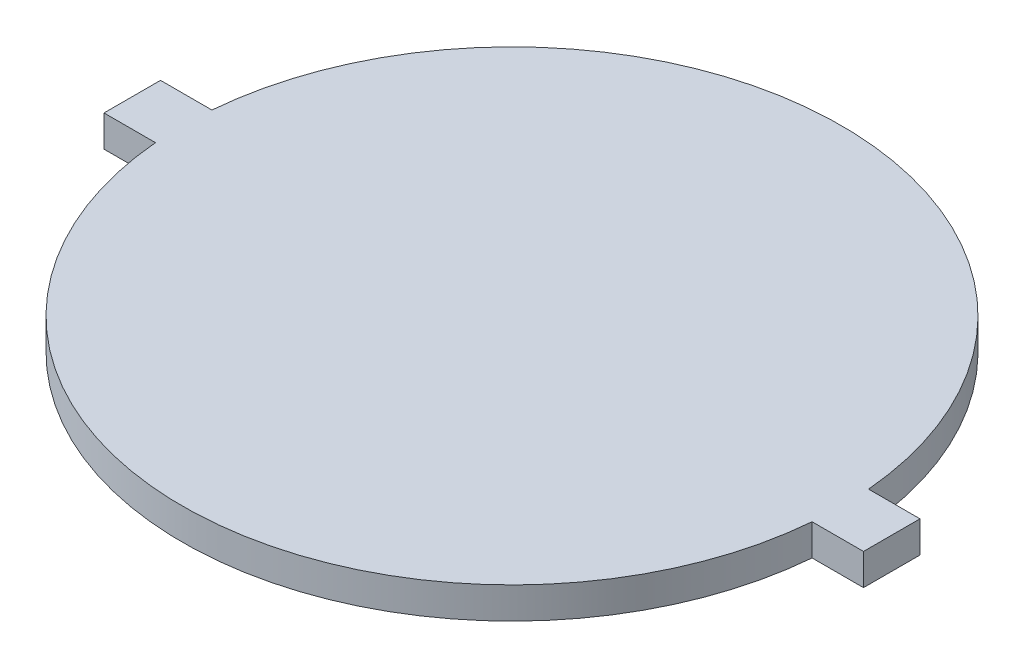
ISO-10303-21;
HEADER;
FILE_DESCRIPTION(('STEP AP214'),'2;1');
FILE_NAME('part.step','',(''),(''),'','','');
FILE_SCHEMA(('AUTOMOTIVE_DESIGN { 1 0 10303 214 1 1 1 1 }'));
ENDSEC;
DATA;
#1=APPLICATION_CONTEXT('core data for automotive mechanical design processes');
#2=APPLICATION_PROTOCOL_DEFINITION('international standard','automotive_design',2000,#1);
#3=PRODUCT_CONTEXT('',#1,'mechanical');
#4=PRODUCT('Part','Part','',(#3));
#5=PRODUCT_RELATED_PRODUCT_CATEGORY('part','',(#4));
#6=PRODUCT_DEFINITION_FORMATION('','',#4);
#7=PRODUCT_DEFINITION_CONTEXT('part definition',#1,'design');
#8=PRODUCT_DEFINITION('design','',#6,#7);
#9=PRODUCT_DEFINITION_SHAPE('','',#8);
#10=(LENGTH_UNIT() NAMED_UNIT(*) SI_UNIT(.MILLI.,.METRE.));
#11=(NAMED_UNIT(*) PLANE_ANGLE_UNIT() SI_UNIT($,.RADIAN.));
#12=(NAMED_UNIT(*) SI_UNIT($,.STERADIAN.) SOLID_ANGLE_UNIT());
#13=UNCERTAINTY_MEASURE_WITH_UNIT(LENGTH_MEASURE(1.E-05),#10,'distance_accuracy_value','');
#14=(GEOMETRIC_REPRESENTATION_CONTEXT(3) GLOBAL_UNCERTAINTY_ASSIGNED_CONTEXT((#13)) GLOBAL_UNIT_ASSIGNED_CONTEXT((#10,
#11,#12)) REPRESENTATION_CONTEXT('',''));
#15=CARTESIAN_POINT('',(0.,0.,0.));
#16=DIRECTION('',(0.,0.,1.));
#17=DIRECTION('',(1.,0.,0.));
#18=AXIS2_PLACEMENT_3D('',#15,#16,#17);
#19=CARTESIAN_POINT('',(0.,5.,0.));
#20=DIRECTION('',(0.,-1.,0.));
#21=DIRECTION('',(0.,0.,-1.));
#22=AXIS2_PLACEMENT_3D('',#19,#20,#21);
#23=CYLINDRICAL_SURFACE('',#22,52.5);
#24=DIRECTION('',(0.,-1.,0.));
#25=VECTOR('',#24,1.);
#26=CARTESIAN_POINT('',(-52.3067873224881,5.,-4.5));
#27=LINE('',#26,#25);
#28=CARTESIAN_POINT('',(-52.3067873224881,5.,-4.5));
#29=VERTEX_POINT('',#28);
#30=CARTESIAN_POINT('',(-52.3067873224881,0.,-4.5));
#31=VERTEX_POINT('',#30);
#32=EDGE_CURVE('E55',#29,#31,#27,.T.);
#33=ORIENTED_EDGE('',*,*,#32,.F.);
#34=CARTESIAN_POINT('',(0.,5.,0.));
#35=DIRECTION('',(0.,1.,0.));
#36=DIRECTION('',(0.,0.,1.));
#37=AXIS2_PLACEMENT_3D('',#34,#35,#36);
#38=CIRCLE('',#37,52.5);
#39=CARTESIAN_POINT('',(52.3067873224881,5.,-4.5));
#40=VERTEX_POINT('',#39);
#41=EDGE_CURVE('E11',#40,#29,#38,.T.);
#42=ORIENTED_EDGE('',*,*,#41,.F.);
#43=DIRECTION('',(0.,-1.,0.));
#44=VECTOR('',#43,1.);
#45=CARTESIAN_POINT('',(52.3067873224881,5.,-4.5));
#46=LINE('',#45,#44);
#47=CARTESIAN_POINT('',(52.3067873224881,0.,-4.5));
#48=VERTEX_POINT('',#47);
#49=EDGE_CURVE('E156',#48,#40,#46,.F.);
#50=ORIENTED_EDGE('',*,*,#49,.F.);
#51=CARTESIAN_POINT('',(0.,0.,0.));
#52=DIRECTION('',(0.,1.,0.));
#53=DIRECTION('',(0.,0.,1.));
#54=AXIS2_PLACEMENT_3D('',#51,#52,#53);
#55=CIRCLE('',#54,52.5);
#56=EDGE_CURVE('E36',#48,#31,#55,.T.);
#57=ORIENTED_EDGE('',*,*,#56,.T.);
#58=EDGE_LOOP('',(#33,#42,#50,#57));
#59=FACE_BOUND('',#58,.T.);
#60=ADVANCED_FACE('F33',(#59),#23,.T.);
#61=DIRECTION('',(0.,-1.,0.));
#62=VECTOR('',#61,1.);
#63=CARTESIAN_POINT('',(-52.3067873224881,5.,4.5));
#64=LINE('',#63,#62);
#65=CARTESIAN_POINT('',(-52.3067873224881,0.,4.5));
#66=VERTEX_POINT('',#65);
#67=CARTESIAN_POINT('',(-52.3067873224881,5.,4.5));
#68=VERTEX_POINT('',#67);
#69=EDGE_CURVE('E114',#66,#68,#64,.F.);
#70=ORIENTED_EDGE('',*,*,#69,.F.);
#71=CARTESIAN_POINT('',(52.3067873224881,0.,4.5));
#72=VERTEX_POINT('',#71);
#73=EDGE_CURVE('E158',#66,#72,#55,.T.);
#74=ORIENTED_EDGE('',*,*,#73,.T.);
#75=DIRECTION('',(0.,-1.,0.));
#76=VECTOR('',#75,1.);
#77=CARTESIAN_POINT('',(52.3067873224881,5.,4.5));
#78=LINE('',#77,#76);
#79=CARTESIAN_POINT('',(52.3067873224881,5.,4.5));
#80=VERTEX_POINT('',#79);
#81=EDGE_CURVE('E153',#80,#72,#78,.T.);
#82=ORIENTED_EDGE('',*,*,#81,.F.);
#83=EDGE_CURVE('E41',#68,#80,#38,.T.);
#84=ORIENTED_EDGE('',*,*,#83,.F.);
#85=EDGE_LOOP('',(#70,#74,#82,#84));
#86=FACE_BOUND('',#85,.T.);
#87=ADVANCED_FACE('F163',(#86),#23,.T.);
#88=CARTESIAN_POINT('',(0.,5.,0.));
#89=DIRECTION('',(0.,1.,0.));
#90=DIRECTION('',(0.,0.,1.));
#91=AXIS2_PLACEMENT_3D('',#88,#89,#90);
#92=PLANE('',#91);
#93=ORIENTED_EDGE('',*,*,#41,.T.);
#94=DIRECTION('',(-1.,0.,0.));
#95=VECTOR('',#94,1.);
#96=CARTESIAN_POINT('',(-60.5,5.,-4.5));
#97=LINE('',#96,#95);
#98=CARTESIAN_POINT('',(-60.5,5.,-4.5));
#99=VERTEX_POINT('',#98);
#100=EDGE_CURVE('E96',#29,#99,#97,.T.);
#101=ORIENTED_EDGE('',*,*,#100,.T.);
#102=DIRECTION('',(0.,0.,1.));
#103=VECTOR('',#102,1.);
#104=CARTESIAN_POINT('',(-60.5,5.,-4.5));
#105=LINE('',#104,#103);
#106=CARTESIAN_POINT('',(-60.5,5.,4.5));
#107=VERTEX_POINT('',#106);
#108=EDGE_CURVE('E101',#99,#107,#105,.T.);
#109=ORIENTED_EDGE('',*,*,#108,.T.);
#110=DIRECTION('',(1.,0.,0.));
#111=VECTOR('',#110,1.);
#112=CARTESIAN_POINT('',(-60.5,5.,4.5));
#113=LINE('',#112,#111);
#114=EDGE_CURVE('E120',#107,#68,#113,.T.);
#115=ORIENTED_EDGE('',*,*,#114,.T.);
#116=ORIENTED_EDGE('',*,*,#83,.T.);
#117=DIRECTION('',(1.,0.,0.));
#118=VECTOR('',#117,1.);
#119=CARTESIAN_POINT('',(44.5,5.,4.5));
#120=LINE('',#119,#118);
#121=CARTESIAN_POINT('',(60.5,5.,4.5));
#122=VERTEX_POINT('',#121);
#123=EDGE_CURVE('E139',#80,#122,#120,.T.);
#124=ORIENTED_EDGE('',*,*,#123,.T.);
#125=DIRECTION('',(0.,0.,-1.));
#126=VECTOR('',#125,1.);
#127=CARTESIAN_POINT('',(60.5,5.,-4.5));
#128=LINE('',#127,#126);
#129=CARTESIAN_POINT('',(60.5,5.,-4.5));
#130=VERTEX_POINT('',#129);
#131=EDGE_CURVE('E133',#122,#130,#128,.T.);
#132=ORIENTED_EDGE('',*,*,#131,.T.);
#133=DIRECTION('',(-1.,0.,0.));
#134=VECTOR('',#133,1.);
#135=CARTESIAN_POINT('',(44.5,5.,-4.5));
#136=LINE('',#135,#134);
#137=EDGE_CURVE('E136',#130,#40,#136,.T.);
#138=ORIENTED_EDGE('',*,*,#137,.T.);
#139=EDGE_LOOP('',(#93,#101,#109,#115,#116,#124,#132,#138));
#140=FACE_BOUND('',#139,.T.);
#141=ADVANCED_FACE('F98',(#140),#92,.T.);
#142=CARTESIAN_POINT('',(0.,0.,0.));
#143=DIRECTION('',(0.,1.,0.));
#144=DIRECTION('',(0.,0.,1.));
#145=AXIS2_PLACEMENT_3D('',#142,#143,#144);
#146=PLANE('',#145);
#147=ORIENTED_EDGE('',*,*,#73,.F.);
#148=DIRECTION('',(1.,0.,0.));
#149=VECTOR('',#148,1.);
#150=CARTESIAN_POINT('',(-60.5,0.,4.5));
#151=LINE('',#150,#149);
#152=CARTESIAN_POINT('',(-60.5,0.,4.5));
#153=VERTEX_POINT('',#152);
#154=EDGE_CURVE('E105',#153,#66,#151,.T.);
#155=ORIENTED_EDGE('',*,*,#154,.F.);
#156=DIRECTION('',(0.,0.,1.));
#157=VECTOR('',#156,1.);
#158=CARTESIAN_POINT('',(-60.5,0.,-4.5));
#159=LINE('',#158,#157);
#160=CARTESIAN_POINT('',(-60.5,0.,-4.5));
#161=VERTEX_POINT('',#160);
#162=EDGE_CURVE('E125',#161,#153,#159,.T.);
#163=ORIENTED_EDGE('',*,*,#162,.F.);
#164=DIRECTION('',(-1.,0.,0.));
#165=VECTOR('',#164,1.);
#166=CARTESIAN_POINT('',(-60.5,0.,-4.5));
#167=LINE('',#166,#165);
#168=EDGE_CURVE('E111',#31,#161,#167,.T.);
#169=ORIENTED_EDGE('',*,*,#168,.F.);
#170=ORIENTED_EDGE('',*,*,#56,.F.);
#171=DIRECTION('',(-1.,0.,0.));
#172=VECTOR('',#171,1.);
#173=CARTESIAN_POINT('',(44.5,0.,-4.5));
#174=LINE('',#173,#172);
#175=CARTESIAN_POINT('',(60.5,0.,-4.5));
#176=VERTEX_POINT('',#175);
#177=EDGE_CURVE('E144',#176,#48,#174,.T.);
#178=ORIENTED_EDGE('',*,*,#177,.F.);
#179=DIRECTION('',(0.,0.,-1.));
#180=VECTOR('',#179,1.);
#181=CARTESIAN_POINT('',(60.5,0.,-4.5));
#182=LINE('',#181,#180);
#183=CARTESIAN_POINT('',(60.5,0.,4.5));
#184=VERTEX_POINT('',#183);
#185=EDGE_CURVE('E132',#184,#176,#182,.T.);
#186=ORIENTED_EDGE('',*,*,#185,.F.);
#187=DIRECTION('',(1.,0.,0.));
#188=VECTOR('',#187,1.);
#189=CARTESIAN_POINT('',(44.5,0.,4.5));
#190=LINE('',#189,#188);
#191=EDGE_CURVE('E137',#72,#184,#190,.T.);
#192=ORIENTED_EDGE('',*,*,#191,.F.);
#193=EDGE_LOOP('',(#147,#155,#163,#169,#170,#178,#186,#192));
#194=FACE_BOUND('',#193,.T.);
#195=ADVANCED_FACE('F174',(#194),#146,.F.);
#196=CARTESIAN_POINT('',(44.5,5.,-4.5));
#197=DIRECTION('',(0.,0.,1.));
#198=DIRECTION('',(1.,0.,0.));
#199=AXIS2_PLACEMENT_3D('',#196,#197,#198);
#200=PLANE('',#199);
#201=ORIENTED_EDGE('',*,*,#177,.T.);
#202=ORIENTED_EDGE('',*,*,#49,.T.);
#203=ORIENTED_EDGE('',*,*,#137,.F.);
#204=DIRECTION('',(0.,-1.,0.));
#205=VECTOR('',#204,1.);
#206=CARTESIAN_POINT('',(60.5,5.,-4.5));
#207=LINE('',#206,#205);
#208=EDGE_CURVE('E150',#130,#176,#207,.T.);
#209=ORIENTED_EDGE('',*,*,#208,.T.);
#210=EDGE_LOOP('',(#201,#202,#203,#209));
#211=FACE_BOUND('',#210,.T.);
#212=ADVANCED_FACE('F172',(#211),#200,.F.);
#213=CARTESIAN_POINT('',(44.5,5.,4.5));
#214=DIRECTION('',(0.,0.,-1.));
#215=DIRECTION('',(-1.,0.,0.));
#216=AXIS2_PLACEMENT_3D('',#213,#214,#215);
#217=PLANE('',#216);
#218=ORIENTED_EDGE('',*,*,#123,.F.);
#219=ORIENTED_EDGE('',*,*,#81,.T.);
#220=ORIENTED_EDGE('',*,*,#191,.T.);
#221=DIRECTION('',(0.,-1.,0.));
#222=VECTOR('',#221,1.);
#223=CARTESIAN_POINT('',(60.5,5.,4.5));
#224=LINE('',#223,#222);
#225=EDGE_CURVE('E141',#122,#184,#224,.T.);
#226=ORIENTED_EDGE('',*,*,#225,.F.);
#227=EDGE_LOOP('',(#218,#219,#220,#226));
#228=FACE_BOUND('',#227,.T.);
#229=ADVANCED_FACE('F166',(#228),#217,.F.);
#230=CARTESIAN_POINT('',(60.5,5.,-4.5));
#231=DIRECTION('',(-1.,0.,0.));
#232=DIRECTION('',(0.,0.,1.));
#233=AXIS2_PLACEMENT_3D('',#230,#231,#232);
#234=PLANE('',#233);
#235=ORIENTED_EDGE('',*,*,#185,.T.);
#236=ORIENTED_EDGE('',*,*,#208,.F.);
#237=ORIENTED_EDGE('',*,*,#131,.F.);
#238=ORIENTED_EDGE('',*,*,#225,.T.);
#239=EDGE_LOOP('',(#235,#236,#237,#238));
#240=FACE_BOUND('',#239,.T.);
#241=ADVANCED_FACE('F171',(#240),#234,.F.);
#242=CARTESIAN_POINT('',(-60.5,5.,-4.5));
#243=DIRECTION('',(0.,0.,1.));
#244=DIRECTION('',(1.,0.,0.));
#245=AXIS2_PLACEMENT_3D('',#242,#243,#244);
#246=PLANE('',#245);
#247=ORIENTED_EDGE('',*,*,#100,.F.);
#248=ORIENTED_EDGE('',*,*,#32,.T.);
#249=ORIENTED_EDGE('',*,*,#168,.T.);
#250=DIRECTION('',(0.,-1.,0.));
#251=VECTOR('',#250,1.);
#252=CARTESIAN_POINT('',(-60.5,5.,-4.5));
#253=LINE('',#252,#251);
#254=EDGE_CURVE('E108',#99,#161,#253,.T.);
#255=ORIENTED_EDGE('',*,*,#254,.F.);
#256=EDGE_LOOP('',(#247,#248,#249,#255));
#257=FACE_BOUND('',#256,.T.);
#258=ADVANCED_FACE('F109',(#257),#246,.F.);
#259=CARTESIAN_POINT('',(-60.5,5.,4.5));
#260=DIRECTION('',(0.,0.,-1.));
#261=DIRECTION('',(-1.,0.,0.));
#262=AXIS2_PLACEMENT_3D('',#259,#260,#261);
#263=PLANE('',#262);
#264=ORIENTED_EDGE('',*,*,#154,.T.);
#265=ORIENTED_EDGE('',*,*,#69,.T.);
#266=ORIENTED_EDGE('',*,*,#114,.F.);
#267=DIRECTION('',(0.,-1.,0.));
#268=VECTOR('',#267,1.);
#269=CARTESIAN_POINT('',(-60.5,5.,4.5));
#270=LINE('',#269,#268);
#271=EDGE_CURVE('E115',#107,#153,#270,.T.);
#272=ORIENTED_EDGE('',*,*,#271,.T.);
#273=EDGE_LOOP('',(#264,#265,#266,#272));
#274=FACE_BOUND('',#273,.T.);
#275=ADVANCED_FACE('F195',(#274),#263,.F.);
#276=CARTESIAN_POINT('',(-60.5,5.,-4.5));
#277=DIRECTION('',(1.,0.,0.));
#278=DIRECTION('',(0.,0.,-1.));
#279=AXIS2_PLACEMENT_3D('',#276,#277,#278);
#280=PLANE('',#279);
#281=ORIENTED_EDGE('',*,*,#162,.T.);
#282=ORIENTED_EDGE('',*,*,#271,.F.);
#283=ORIENTED_EDGE('',*,*,#108,.F.);
#284=ORIENTED_EDGE('',*,*,#254,.T.);
#285=EDGE_LOOP('',(#281,#282,#283,#284));
#286=FACE_BOUND('',#285,.T.);
#287=ADVANCED_FACE('F117',(#286),#280,.F.);
#288=CLOSED_SHELL('',(#60,#87,#141,#195,#212,#229,#241,#258,#275,#287));
#289=MANIFOLD_SOLID_BREP('B2',#288);
#290=ADVANCED_BREP_SHAPE_REPRESENTATION('',(#18,#289),#14);
#291=SHAPE_DEFINITION_REPRESENTATION(#9,#290);
ENDSEC;
END-ISO-10303-21;
